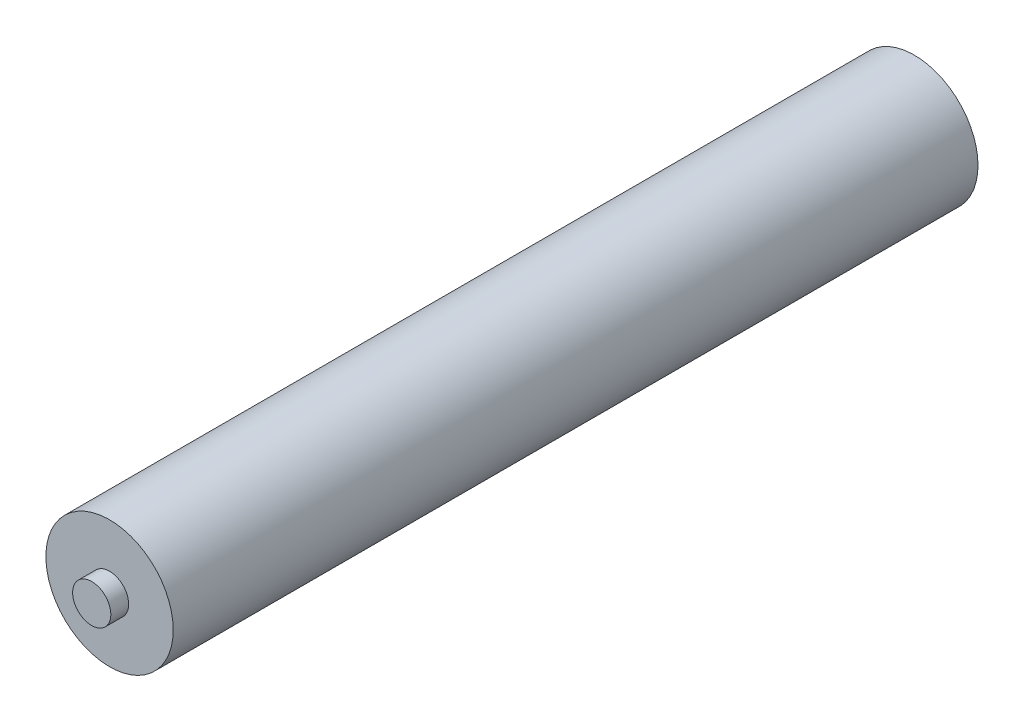
ISO-10303-21;
HEADER;
FILE_DESCRIPTION(('STEP AP214'),'2;1');
FILE_NAME('part.step','',(''),(''),'','','');
FILE_SCHEMA(('AUTOMOTIVE_DESIGN { 1 0 10303 214 1 1 1 1 }'));
ENDSEC;
DATA;
#1=APPLICATION_CONTEXT('core data for automotive mechanical design processes');
#2=APPLICATION_PROTOCOL_DEFINITION('international standard','automotive_design',2000,#1);
#3=PRODUCT_CONTEXT('',#1,'mechanical');
#4=PRODUCT('Part','Part','',(#3));
#5=PRODUCT_RELATED_PRODUCT_CATEGORY('part','',(#4));
#6=PRODUCT_DEFINITION_FORMATION('','',#4);
#7=PRODUCT_DEFINITION_CONTEXT('part definition',#1,'design');
#8=PRODUCT_DEFINITION('design','',#6,#7);
#9=PRODUCT_DEFINITION_SHAPE('','',#8);
#10=(LENGTH_UNIT() NAMED_UNIT(*) SI_UNIT(.MILLI.,.METRE.));
#11=(NAMED_UNIT(*) PLANE_ANGLE_UNIT() SI_UNIT($,.RADIAN.));
#12=(NAMED_UNIT(*) SI_UNIT($,.STERADIAN.) SOLID_ANGLE_UNIT());
#13=UNCERTAINTY_MEASURE_WITH_UNIT(LENGTH_MEASURE(1.E-05),#10,'distance_accuracy_value','');
#14=(GEOMETRIC_REPRESENTATION_CONTEXT(3) GLOBAL_UNCERTAINTY_ASSIGNED_CONTEXT((#13)) GLOBAL_UNIT_ASSIGNED_CONTEXT((#10,
#11,#12)) REPRESENTATION_CONTEXT('',''));
#15=CARTESIAN_POINT('',(0.,0.,0.));
#16=DIRECTION('',(0.,0.,1.));
#17=DIRECTION('',(1.,0.,0.));
#18=AXIS2_PLACEMENT_3D('',#15,#16,#17);
#19=CARTESIAN_POINT('',(0.,0.,79.));
#20=DIRECTION('',(0.,0.,-1.));
#21=DIRECTION('',(-1.,0.,0.));
#22=AXIS2_PLACEMENT_3D('',#19,#20,#21);
#23=CYLINDRICAL_SURFACE('',#22,12.5);
#24=CARTESIAN_POINT('',(0.,0.,79.));
#25=DIRECTION('',(0.,0.,1.));
#26=DIRECTION('',(1.,0.,0.));
#27=AXIS2_PLACEMENT_3D('',#24,#25,#26);
#28=CIRCLE('',#27,12.5);
#29=CARTESIAN_POINT('',(12.5,0.,79.));
#30=VERTEX_POINT('',#29);
#31=EDGE_CURVE('E10',#30,#30,#28,.T.);
#32=ORIENTED_EDGE('',*,*,#31,.F.);
#33=EDGE_LOOP('',(#32));
#34=FACE_BOUND('',#33,.T.);
#35=CARTESIAN_POINT('',(0.,0.,-79.));
#36=DIRECTION('',(0.,0.,1.));
#37=DIRECTION('',(1.,0.,0.));
#38=AXIS2_PLACEMENT_3D('',#35,#36,#37);
#39=CIRCLE('',#38,12.5);
#40=CARTESIAN_POINT('',(12.5,0.,-79.));
#41=VERTEX_POINT('',#40);
#42=EDGE_CURVE('E46',#41,#41,#39,.T.);
#43=ORIENTED_EDGE('',*,*,#42,.T.);
#44=EDGE_LOOP('',(#43));
#45=FACE_BOUND('',#44,.T.);
#46=ADVANCED_FACE('F39',(#34,#45),#23,.T.);
#47=CARTESIAN_POINT('',(0.,0.,79.));
#48=DIRECTION('',(0.,0.,1.));
#49=DIRECTION('',(1.,0.,0.));
#50=AXIS2_PLACEMENT_3D('',#47,#48,#49);
#51=PLANE('',#50);
#52=CARTESIAN_POINT('',(0.,0.,79.));
#53=DIRECTION('',(0.,0.,1.));
#54=DIRECTION('',(1.,0.,0.));
#55=AXIS2_PLACEMENT_3D('',#52,#53,#54);
#56=CIRCLE('',#55,3.75);
#57=CARTESIAN_POINT('',(3.75,0.,79.));
#58=VERTEX_POINT('',#57);
#59=EDGE_CURVE('E51',#58,#58,#56,.F.);
#60=ORIENTED_EDGE('',*,*,#59,.T.);
#61=EDGE_LOOP('',(#60));
#62=FACE_BOUND('',#61,.T.);
#63=ORIENTED_EDGE('',*,*,#31,.T.);
#64=EDGE_LOOP('',(#63));
#65=FACE_BOUND('',#64,.T.);
#66=ADVANCED_FACE('F81',(#62,#65),#51,.T.);
#67=CARTESIAN_POINT('',(0.,0.,-79.));
#68=DIRECTION('',(0.,0.,1.));
#69=DIRECTION('',(1.,0.,0.));
#70=AXIS2_PLACEMENT_3D('',#67,#68,#69);
#71=PLANE('',#70);
#72=CARTESIAN_POINT('',(0.,0.,-79.));
#73=DIRECTION('',(0.,0.,1.));
#74=DIRECTION('',(1.,0.,0.));
#75=AXIS2_PLACEMENT_3D('',#72,#73,#74);
#76=CIRCLE('',#75,3.75);
#77=CARTESIAN_POINT('',(3.75,0.,-79.));
#78=VERTEX_POINT('',#77);
#79=EDGE_CURVE('E42',#78,#78,#76,.T.);
#80=ORIENTED_EDGE('',*,*,#79,.T.);
#81=EDGE_LOOP('',(#80));
#82=FACE_BOUND('',#81,.T.);
#83=ORIENTED_EDGE('',*,*,#42,.F.);
#84=EDGE_LOOP('',(#83));
#85=FACE_BOUND('',#84,.T.);
#86=ADVANCED_FACE('F86',(#82,#85),#71,.F.);
#87=CARTESIAN_POINT('',(0.,0.,82.5));
#88=DIRECTION('',(0.,0.,-1.));
#89=DIRECTION('',(-1.,0.,0.));
#90=AXIS2_PLACEMENT_3D('',#87,#88,#89);
#91=CYLINDRICAL_SURFACE('',#90,3.75);
#92=ORIENTED_EDGE('',*,*,#59,.F.);
#93=EDGE_LOOP('',(#92));
#94=FACE_BOUND('',#93,.T.);
#95=CARTESIAN_POINT('',(0.,0.,82.5));
#96=DIRECTION('',(0.,0.,1.));
#97=DIRECTION('',(1.,0.,0.));
#98=AXIS2_PLACEMENT_3D('',#95,#96,#97);
#99=CIRCLE('',#98,3.75);
#100=CARTESIAN_POINT('',(3.75,0.,82.5));
#101=VERTEX_POINT('',#100);
#102=EDGE_CURVE('E54',#101,#101,#99,.T.);
#103=ORIENTED_EDGE('',*,*,#102,.F.);
#104=EDGE_LOOP('',(#103));
#105=FACE_BOUND('',#104,.T.);
#106=ADVANCED_FACE('F92',(#94,#105),#91,.T.);
#107=CARTESIAN_POINT('',(0.,0.,82.5));
#108=DIRECTION('',(0.,0.,1.));
#109=DIRECTION('',(1.,0.,0.));
#110=AXIS2_PLACEMENT_3D('',#107,#108,#109);
#111=PLANE('',#110);
#112=ORIENTED_EDGE('',*,*,#102,.T.);
#113=EDGE_LOOP('',(#112));
#114=FACE_BOUND('',#113,.T.);
#115=ADVANCED_FACE('F78',(#114),#111,.T.);
#116=CARTESIAN_POINT('',(0.,0.,-82.5));
#117=DIRECTION('',(0.,0.,1.));
#118=DIRECTION('',(1.,0.,0.));
#119=AXIS2_PLACEMENT_3D('',#116,#117,#118);
#120=CYLINDRICAL_SURFACE('',#119,3.75);
#121=CARTESIAN_POINT('',(0.,0.,-82.5));
#122=DIRECTION('',(0.,0.,1.));
#123=DIRECTION('',(1.,0.,0.));
#124=AXIS2_PLACEMENT_3D('',#121,#122,#123);
#125=CIRCLE('',#124,3.75);
#126=CARTESIAN_POINT('',(3.75,0.,-82.5));
#127=VERTEX_POINT('',#126);
#128=EDGE_CURVE('E63',#127,#127,#125,.T.);
#129=ORIENTED_EDGE('',*,*,#128,.T.);
#130=EDGE_LOOP('',(#129));
#131=FACE_BOUND('',#130,.T.);
#132=ORIENTED_EDGE('',*,*,#79,.F.);
#133=EDGE_LOOP('',(#132));
#134=FACE_BOUND('',#133,.T.);
#135=ADVANCED_FACE('F69',(#131,#134),#120,.T.);
#136=CARTESIAN_POINT('',(0.,0.,-82.5));
#137=DIRECTION('',(0.,0.,-1.));
#138=DIRECTION('',(1.,0.,0.));
#139=AXIS2_PLACEMENT_3D('',#136,#137,#138);
#140=PLANE('',#139);
#141=ORIENTED_EDGE('',*,*,#128,.F.);
#142=EDGE_LOOP('',(#141));
#143=FACE_BOUND('',#142,.T.);
#144=ADVANCED_FACE('F72',(#143),#140,.T.);
#145=CLOSED_SHELL('',(#46,#66,#86,#106,#115,#135,#144));
#146=MANIFOLD_SOLID_BREP('B2',#145);
#147=ADVANCED_BREP_SHAPE_REPRESENTATION('',(#18,#146),#14);
#148=SHAPE_DEFINITION_REPRESENTATION(#9,#147);
ENDSEC;
END-ISO-10303-21;
